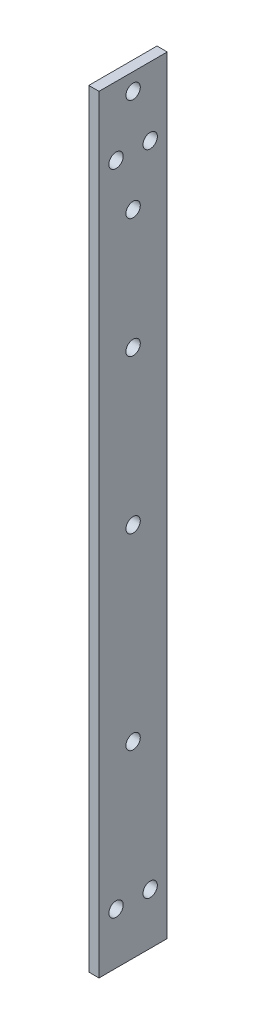
ISO-10303-21;
HEADER;
FILE_DESCRIPTION(('STEP AP214'),'2;1');
FILE_NAME('part.step','',(''),(''),'','','');
FILE_SCHEMA(('AUTOMOTIVE_DESIGN { 1 0 10303 214 1 1 1 1 }'));
ENDSEC;
DATA;
#1=APPLICATION_CONTEXT('core data for automotive mechanical design processes');
#2=APPLICATION_PROTOCOL_DEFINITION('international standard','automotive_design',2000,#1);
#3=PRODUCT_CONTEXT('',#1,'mechanical');
#4=PRODUCT('Part','Part','',(#3));
#5=PRODUCT_RELATED_PRODUCT_CATEGORY('part','',(#4));
#6=PRODUCT_DEFINITION_FORMATION('','',#4);
#7=PRODUCT_DEFINITION_CONTEXT('part definition',#1,'design');
#8=PRODUCT_DEFINITION('design','',#6,#7);
#9=PRODUCT_DEFINITION_SHAPE('','',#8);
#10=(LENGTH_UNIT() NAMED_UNIT(*) SI_UNIT(.MILLI.,.METRE.));
#11=(NAMED_UNIT(*) PLANE_ANGLE_UNIT() SI_UNIT($,.RADIAN.));
#12=(NAMED_UNIT(*) SI_UNIT($,.STERADIAN.) SOLID_ANGLE_UNIT());
#13=UNCERTAINTY_MEASURE_WITH_UNIT(LENGTH_MEASURE(1.E-05),#10,'distance_accuracy_value','');
#14=(GEOMETRIC_REPRESENTATION_CONTEXT(3) GLOBAL_UNCERTAINTY_ASSIGNED_CONTEXT((#13)) GLOBAL_UNIT_ASSIGNED_CONTEXT((#10,
#11,#12)) REPRESENTATION_CONTEXT('',''));
#15=CARTESIAN_POINT('',(0.,0.,0.));
#16=DIRECTION('',(0.,0.,1.));
#17=DIRECTION('',(1.,0.,0.));
#18=AXIS2_PLACEMENT_3D('',#15,#16,#17);
#19=CARTESIAN_POINT('',(-36.,220.,20.));
#20=DIRECTION('',(0.,1.,0.));
#21=DIRECTION('',(0.,0.,1.));
#22=AXIS2_PLACEMENT_3D('',#19,#20,#21);
#23=PLANE('',#22);
#24=DIRECTION('',(0.,0.,-1.));
#25=VECTOR('',#24,1.);
#26=CARTESIAN_POINT('',(-39.,220.,20.));
#27=LINE('',#26,#25);
#28=CARTESIAN_POINT('',(-39.,220.,20.));
#29=VERTEX_POINT('',#28);
#30=CARTESIAN_POINT('',(-39.,220.,0.));
#31=VERTEX_POINT('',#30);
#32=EDGE_CURVE('E97',#29,#31,#27,.T.);
#33=ORIENTED_EDGE('',*,*,#32,.F.);
#34=DIRECTION('',(-1.,0.,0.));
#35=VECTOR('',#34,1.);
#36=CARTESIAN_POINT('',(-36.,220.,20.));
#37=LINE('',#36,#35);
#38=CARTESIAN_POINT('',(-36.,220.,20.));
#39=VERTEX_POINT('',#38);
#40=EDGE_CURVE('E11',#39,#29,#37,.T.);
#41=ORIENTED_EDGE('',*,*,#40,.F.);
#42=DIRECTION('',(0.,0.,-1.));
#43=VECTOR('',#42,1.);
#44=CARTESIAN_POINT('',(-36.,220.,20.));
#45=LINE('',#44,#43);
#46=CARTESIAN_POINT('',(-36.,220.,0.));
#47=VERTEX_POINT('',#46);
#48=EDGE_CURVE('E90',#39,#47,#45,.T.);
#49=ORIENTED_EDGE('',*,*,#48,.T.);
#50=DIRECTION('',(-1.,0.,0.));
#51=VECTOR('',#50,1.);
#52=CARTESIAN_POINT('',(-36.,220.,0.));
#53=LINE('',#52,#51);
#54=EDGE_CURVE('E35',#47,#31,#53,.T.);
#55=ORIENTED_EDGE('',*,*,#54,.T.);
#56=EDGE_LOOP('',(#33,#41,#49,#55));
#57=FACE_BOUND('',#56,.T.);
#58=ADVANCED_FACE('F32',(#57),#23,.T.);
#59=CARTESIAN_POINT('',(-36.,-5.,20.));
#60=DIRECTION('',(0.,0.,1.));
#61=DIRECTION('',(1.,0.,0.));
#62=AXIS2_PLACEMENT_3D('',#59,#60,#61);
#63=PLANE('',#62);
#64=DIRECTION('',(0.,1.,0.));
#65=VECTOR('',#64,1.);
#66=CARTESIAN_POINT('',(-39.,-5.,20.));
#67=LINE('',#66,#65);
#68=CARTESIAN_POINT('',(-39.,-5.,20.));
#69=VERTEX_POINT('',#68);
#70=EDGE_CURVE('E92',#69,#29,#67,.T.);
#71=ORIENTED_EDGE('',*,*,#70,.F.);
#72=DIRECTION('',(-1.,0.,0.));
#73=VECTOR('',#72,1.);
#74=CARTESIAN_POINT('',(-36.,-5.,20.));
#75=LINE('',#74,#73);
#76=CARTESIAN_POINT('',(-36.,-5.,20.));
#77=VERTEX_POINT('',#76);
#78=EDGE_CURVE('E41',#77,#69,#75,.T.);
#79=ORIENTED_EDGE('',*,*,#78,.F.);
#80=DIRECTION('',(0.,1.,0.));
#81=VECTOR('',#80,1.);
#82=CARTESIAN_POINT('',(-36.,-5.,20.));
#83=LINE('',#82,#81);
#84=EDGE_CURVE('E87',#77,#39,#83,.T.);
#85=ORIENTED_EDGE('',*,*,#84,.T.);
#86=ORIENTED_EDGE('',*,*,#40,.T.);
#87=EDGE_LOOP('',(#71,#79,#85,#86));
#88=FACE_BOUND('',#87,.T.);
#89=ADVANCED_FACE('F108',(#88),#63,.T.);
#90=CARTESIAN_POINT('',(-36.,-5.,0.));
#91=DIRECTION('',(0.,-1.,0.));
#92=DIRECTION('',(0.,0.,-1.));
#93=AXIS2_PLACEMENT_3D('',#90,#91,#92);
#94=PLANE('',#93);
#95=DIRECTION('',(0.,0.,1.));
#96=VECTOR('',#95,1.);
#97=CARTESIAN_POINT('',(-39.,-5.,0.));
#98=LINE('',#97,#96);
#99=CARTESIAN_POINT('',(-39.,-5.,0.));
#100=VERTEX_POINT('',#99);
#101=EDGE_CURVE('E82',#100,#69,#98,.T.);
#102=ORIENTED_EDGE('',*,*,#101,.F.);
#103=DIRECTION('',(-1.,0.,0.));
#104=VECTOR('',#103,1.);
#105=CARTESIAN_POINT('',(-36.,-5.,0.));
#106=LINE('',#105,#104);
#107=CARTESIAN_POINT('',(-36.,-5.,0.));
#108=VERTEX_POINT('',#107);
#109=EDGE_CURVE('E77',#108,#100,#106,.T.);
#110=ORIENTED_EDGE('',*,*,#109,.F.);
#111=DIRECTION('',(0.,0.,1.));
#112=VECTOR('',#111,1.);
#113=CARTESIAN_POINT('',(-36.,-5.,0.));
#114=LINE('',#113,#112);
#115=EDGE_CURVE('E80',#108,#77,#114,.T.);
#116=ORIENTED_EDGE('',*,*,#115,.T.);
#117=ORIENTED_EDGE('',*,*,#78,.T.);
#118=EDGE_LOOP('',(#102,#110,#116,#117));
#119=FACE_BOUND('',#118,.T.);
#120=ADVANCED_FACE('F79',(#119),#94,.T.);
#121=CARTESIAN_POINT('',(-36.,220.,0.));
#122=DIRECTION('',(0.,0.,-1.));
#123=DIRECTION('',(-1.,0.,0.));
#124=AXIS2_PLACEMENT_3D('',#121,#122,#123);
#125=PLANE('',#124);
#126=DIRECTION('',(0.,-1.,0.));
#127=VECTOR('',#126,1.);
#128=CARTESIAN_POINT('',(-39.,220.,0.));
#129=LINE('',#128,#127);
#130=EDGE_CURVE('E100',#31,#100,#129,.T.);
#131=ORIENTED_EDGE('',*,*,#130,.F.);
#132=ORIENTED_EDGE('',*,*,#54,.F.);
#133=DIRECTION('',(0.,-1.,0.));
#134=VECTOR('',#133,1.);
#135=CARTESIAN_POINT('',(-36.,220.,0.));
#136=LINE('',#135,#134);
#137=EDGE_CURVE('E86',#47,#108,#136,.T.);
#138=ORIENTED_EDGE('',*,*,#137,.T.);
#139=ORIENTED_EDGE('',*,*,#109,.T.);
#140=EDGE_LOOP('',(#131,#132,#138,#139));
#141=FACE_BOUND('',#140,.T.);
#142=ADVANCED_FACE('F89',(#141),#125,.T.);
#143=CARTESIAN_POINT('',(-36.,0.,0.));
#144=DIRECTION('',(-1.,0.,0.));
#145=DIRECTION('',(0.,0.,1.));
#146=AXIS2_PLACEMENT_3D('',#143,#144,#145);
#147=PLANE('',#146);
#148=CARTESIAN_POINT('',(-36.,50.,9.99999999999999));
#149=DIRECTION('',(-1.,0.,0.));
#150=DIRECTION('',(0.,0.,-1.));
#151=AXIS2_PLACEMENT_3D('',#148,#149,#150);
#152=CIRCLE('',#151,2.09999999999999);
#153=CARTESIAN_POINT('',(-36.,50.,7.9));
#154=VERTEX_POINT('',#153);
#155=EDGE_CURVE('E169',#154,#154,#152,.T.);
#156=ORIENTED_EDGE('',*,*,#155,.T.);
#157=EDGE_LOOP('',(#156));
#158=FACE_BOUND('',#157,.T.);
#159=CARTESIAN_POINT('',(-36.,105.,10.));
#160=DIRECTION('',(-1.,0.,0.));
#161=DIRECTION('',(0.,0.,-1.));
#162=AXIS2_PLACEMENT_3D('',#159,#160,#161);
#163=CIRCLE('',#162,2.09999999999999);
#164=CARTESIAN_POINT('',(-36.,105.,7.90000000000001));
#165=VERTEX_POINT('',#164);
#166=EDGE_CURVE('E177',#165,#165,#163,.T.);
#167=ORIENTED_EDGE('',*,*,#166,.T.);
#168=EDGE_LOOP('',(#167));
#169=FACE_BOUND('',#168,.T.);
#170=CARTESIAN_POINT('',(-36.,150.,10.));
#171=DIRECTION('',(-1.,0.,0.));
#172=DIRECTION('',(0.,0.,-1.));
#173=AXIS2_PLACEMENT_3D('',#170,#171,#172);
#174=CIRCLE('',#173,2.09999999999999);
#175=CARTESIAN_POINT('',(-36.,150.,7.90000000000001));
#176=VERTEX_POINT('',#175);
#177=EDGE_CURVE('E183',#176,#176,#174,.T.);
#178=ORIENTED_EDGE('',*,*,#177,.T.);
#179=EDGE_LOOP('',(#178));
#180=FACE_BOUND('',#179,.T.);
#181=CARTESIAN_POINT('',(-36.,200.,5.));
#182=DIRECTION('',(-1.,0.,0.));
#183=DIRECTION('',(0.,0.,-1.));
#184=AXIS2_PLACEMENT_3D('',#181,#182,#183);
#185=CIRCLE('',#184,2.09999999999999);
#186=CARTESIAN_POINT('',(-36.,200.,2.90000000000001));
#187=VERTEX_POINT('',#186);
#188=EDGE_CURVE('E189',#187,#187,#185,.T.);
#189=ORIENTED_EDGE('',*,*,#188,.T.);
#190=EDGE_LOOP('',(#189));
#191=FACE_BOUND('',#190,.T.);
#192=CARTESIAN_POINT('',(-36.,10.,15.));
#193=DIRECTION('',(-1.,0.,0.));
#194=DIRECTION('',(0.,0.,-1.));
#195=AXIS2_PLACEMENT_3D('',#192,#193,#194);
#196=CIRCLE('',#195,2.1);
#197=CARTESIAN_POINT('',(-36.,10.,12.9));
#198=VERTEX_POINT('',#197);
#199=EDGE_CURVE('E195',#198,#198,#196,.T.);
#200=ORIENTED_EDGE('',*,*,#199,.T.);
#201=EDGE_LOOP('',(#200));
#202=FACE_BOUND('',#201,.T.);
#203=CARTESIAN_POINT('',(-36.,10.,5.));
#204=DIRECTION('',(-1.,0.,0.));
#205=DIRECTION('',(0.,0.,-1.));
#206=AXIS2_PLACEMENT_3D('',#203,#204,#205);
#207=CIRCLE('',#206,2.1);
#208=CARTESIAN_POINT('',(-36.,10.,2.9));
#209=VERTEX_POINT('',#208);
#210=EDGE_CURVE('E201',#209,#209,#207,.T.);
#211=ORIENTED_EDGE('',*,*,#210,.T.);
#212=EDGE_LOOP('',(#211));
#213=FACE_BOUND('',#212,.T.);
#214=CARTESIAN_POINT('',(-36.,185.,10.));
#215=DIRECTION('',(-1.,0.,0.));
#216=DIRECTION('',(0.,0.,-1.));
#217=AXIS2_PLACEMENT_3D('',#214,#215,#216);
#218=CIRCLE('',#217,2.09999999999999);
#219=CARTESIAN_POINT('',(-36.,185.,7.90000000000001));
#220=VERTEX_POINT('',#219);
#221=EDGE_CURVE('E207',#220,#220,#218,.T.);
#222=ORIENTED_EDGE('',*,*,#221,.T.);
#223=EDGE_LOOP('',(#222));
#224=FACE_BOUND('',#223,.T.);
#225=CARTESIAN_POINT('',(-36.,200.,15.));
#226=DIRECTION('',(-1.,0.,0.));
#227=DIRECTION('',(0.,0.,-1.));
#228=AXIS2_PLACEMENT_3D('',#225,#226,#227);
#229=CIRCLE('',#228,2.09999999999999);
#230=CARTESIAN_POINT('',(-36.,200.,12.9));
#231=VERTEX_POINT('',#230);
#232=EDGE_CURVE('E213',#231,#231,#229,.T.);
#233=ORIENTED_EDGE('',*,*,#232,.T.);
#234=EDGE_LOOP('',(#233));
#235=FACE_BOUND('',#234,.T.);
#236=CARTESIAN_POINT('',(-36.,215.,10.));
#237=DIRECTION('',(-1.,0.,0.));
#238=DIRECTION('',(0.,0.,-1.));
#239=AXIS2_PLACEMENT_3D('',#236,#237,#238);
#240=CIRCLE('',#239,2.09999999999999);
#241=CARTESIAN_POINT('',(-36.,215.,7.90000000000001));
#242=VERTEX_POINT('',#241);
#243=EDGE_CURVE('E101',#242,#242,#240,.T.);
#244=ORIENTED_EDGE('',*,*,#243,.T.);
#245=EDGE_LOOP('',(#244));
#246=FACE_BOUND('',#245,.T.);
#247=ORIENTED_EDGE('',*,*,#48,.F.);
#248=ORIENTED_EDGE('',*,*,#84,.F.);
#249=ORIENTED_EDGE('',*,*,#115,.F.);
#250=ORIENTED_EDGE('',*,*,#137,.F.);
#251=EDGE_LOOP('',(#247,#248,#249,#250));
#252=FACE_BOUND('',#251,.T.);
#253=ADVANCED_FACE('F85',(#158,#169,#180,#191,#202,#213,#224,#235,#246,#252),#147,.F.);
#254=CARTESIAN_POINT('',(-39.,0.,0.));
#255=DIRECTION('',(-1.,0.,0.));
#256=DIRECTION('',(0.,0.,1.));
#257=AXIS2_PLACEMENT_3D('',#254,#255,#256);
#258=PLANE('',#257);
#259=CARTESIAN_POINT('',(-39.,50.,9.99999999999999));
#260=DIRECTION('',(-1.,0.,0.));
#261=DIRECTION('',(0.,0.,-1.));
#262=AXIS2_PLACEMENT_3D('',#259,#260,#261);
#263=CIRCLE('',#262,2.09999999999999);
#264=CARTESIAN_POINT('',(-39.,50.,7.9));
#265=VERTEX_POINT('',#264);
#266=EDGE_CURVE('E172',#265,#265,#263,.T.);
#267=ORIENTED_EDGE('',*,*,#266,.F.);
#268=EDGE_LOOP('',(#267));
#269=FACE_BOUND('',#268,.T.);
#270=CARTESIAN_POINT('',(-39.,105.,10.));
#271=DIRECTION('',(-1.,0.,0.));
#272=DIRECTION('',(0.,0.,-1.));
#273=AXIS2_PLACEMENT_3D('',#270,#271,#272);
#274=CIRCLE('',#273,2.09999999999999);
#275=CARTESIAN_POINT('',(-39.,105.,7.90000000000001));
#276=VERTEX_POINT('',#275);
#277=EDGE_CURVE('E174',#276,#276,#274,.T.);
#278=ORIENTED_EDGE('',*,*,#277,.F.);
#279=EDGE_LOOP('',(#278));
#280=FACE_BOUND('',#279,.T.);
#281=CARTESIAN_POINT('',(-39.,150.,10.));
#282=DIRECTION('',(-1.,0.,0.));
#283=DIRECTION('',(0.,0.,-1.));
#284=AXIS2_PLACEMENT_3D('',#281,#282,#283);
#285=CIRCLE('',#284,2.09999999999999);
#286=CARTESIAN_POINT('',(-39.,150.,7.90000000000001));
#287=VERTEX_POINT('',#286);
#288=EDGE_CURVE('E180',#287,#287,#285,.T.);
#289=ORIENTED_EDGE('',*,*,#288,.F.);
#290=EDGE_LOOP('',(#289));
#291=FACE_BOUND('',#290,.T.);
#292=CARTESIAN_POINT('',(-39.,200.,5.));
#293=DIRECTION('',(-1.,0.,0.));
#294=DIRECTION('',(0.,0.,-1.));
#295=AXIS2_PLACEMENT_3D('',#292,#293,#294);
#296=CIRCLE('',#295,2.09999999999999);
#297=CARTESIAN_POINT('',(-39.,200.,2.90000000000001));
#298=VERTEX_POINT('',#297);
#299=EDGE_CURVE('E186',#298,#298,#296,.T.);
#300=ORIENTED_EDGE('',*,*,#299,.F.);
#301=EDGE_LOOP('',(#300));
#302=FACE_BOUND('',#301,.T.);
#303=CARTESIAN_POINT('',(-39.,10.,15.));
#304=DIRECTION('',(-1.,0.,0.));
#305=DIRECTION('',(0.,0.,-1.));
#306=AXIS2_PLACEMENT_3D('',#303,#304,#305);
#307=CIRCLE('',#306,2.1);
#308=CARTESIAN_POINT('',(-39.,10.,12.9));
#309=VERTEX_POINT('',#308);
#310=EDGE_CURVE('E192',#309,#309,#307,.T.);
#311=ORIENTED_EDGE('',*,*,#310,.F.);
#312=EDGE_LOOP('',(#311));
#313=FACE_BOUND('',#312,.T.);
#314=CARTESIAN_POINT('',(-39.,10.,5.));
#315=DIRECTION('',(-1.,0.,0.));
#316=DIRECTION('',(0.,0.,-1.));
#317=AXIS2_PLACEMENT_3D('',#314,#315,#316);
#318=CIRCLE('',#317,2.1);
#319=CARTESIAN_POINT('',(-39.,10.,2.9));
#320=VERTEX_POINT('',#319);
#321=EDGE_CURVE('E198',#320,#320,#318,.T.);
#322=ORIENTED_EDGE('',*,*,#321,.F.);
#323=EDGE_LOOP('',(#322));
#324=FACE_BOUND('',#323,.T.);
#325=CARTESIAN_POINT('',(-39.,185.,10.));
#326=DIRECTION('',(-1.,0.,0.));
#327=DIRECTION('',(0.,0.,-1.));
#328=AXIS2_PLACEMENT_3D('',#325,#326,#327);
#329=CIRCLE('',#328,2.09999999999999);
#330=CARTESIAN_POINT('',(-39.,185.,7.90000000000001));
#331=VERTEX_POINT('',#330);
#332=EDGE_CURVE('E204',#331,#331,#329,.T.);
#333=ORIENTED_EDGE('',*,*,#332,.F.);
#334=EDGE_LOOP('',(#333));
#335=FACE_BOUND('',#334,.T.);
#336=CARTESIAN_POINT('',(-39.,200.,15.));
#337=DIRECTION('',(-1.,0.,0.));
#338=DIRECTION('',(0.,0.,-1.));
#339=AXIS2_PLACEMENT_3D('',#336,#337,#338);
#340=CIRCLE('',#339,2.09999999999999);
#341=CARTESIAN_POINT('',(-39.,200.,12.9));
#342=VERTEX_POINT('',#341);
#343=EDGE_CURVE('E210',#342,#342,#340,.T.);
#344=ORIENTED_EDGE('',*,*,#343,.F.);
#345=EDGE_LOOP('',(#344));
#346=FACE_BOUND('',#345,.T.);
#347=CARTESIAN_POINT('',(-39.,215.,10.));
#348=DIRECTION('',(-1.,0.,0.));
#349=DIRECTION('',(0.,0.,-1.));
#350=AXIS2_PLACEMENT_3D('',#347,#348,#349);
#351=CIRCLE('',#350,2.09999999999999);
#352=CARTESIAN_POINT('',(-39.,215.,7.90000000000001));
#353=VERTEX_POINT('',#352);
#354=EDGE_CURVE('E216',#353,#353,#351,.T.);
#355=ORIENTED_EDGE('',*,*,#354,.F.);
#356=EDGE_LOOP('',(#355));
#357=FACE_BOUND('',#356,.T.);
#358=ORIENTED_EDGE('',*,*,#32,.T.);
#359=ORIENTED_EDGE('',*,*,#130,.T.);
#360=ORIENTED_EDGE('',*,*,#101,.T.);
#361=ORIENTED_EDGE('',*,*,#70,.T.);
#362=EDGE_LOOP('',(#358,#359,#360,#361));
#363=FACE_BOUND('',#362,.T.);
#364=ADVANCED_FACE('F107',(#269,#280,#291,#302,#313,#324,#335,#346,#357,#363),#258,.T.);
#365=CARTESIAN_POINT('',(-36.,215.,10.));
#366=DIRECTION('',(-1.,0.,0.));
#367=DIRECTION('',(0.,0.,1.));
#368=AXIS2_PLACEMENT_3D('',#365,#366,#367);
#369=CYLINDRICAL_SURFACE('',#368,2.09999999999999);
#370=ORIENTED_EDGE('',*,*,#243,.F.);
#371=EDGE_LOOP('',(#370));
#372=FACE_BOUND('',#371,.T.);
#373=ORIENTED_EDGE('',*,*,#354,.T.);
#374=EDGE_LOOP('',(#373));
#375=FACE_BOUND('',#374,.T.);
#376=ADVANCED_FACE('F126',(#372,#375),#369,.F.);
#377=CARTESIAN_POINT('',(-36.,200.,15.));
#378=DIRECTION('',(-1.,0.,0.));
#379=DIRECTION('',(0.,0.,1.));
#380=AXIS2_PLACEMENT_3D('',#377,#378,#379);
#381=CYLINDRICAL_SURFACE('',#380,2.09999999999999);
#382=ORIENTED_EDGE('',*,*,#232,.F.);
#383=EDGE_LOOP('',(#382));
#384=FACE_BOUND('',#383,.T.);
#385=ORIENTED_EDGE('',*,*,#343,.T.);
#386=EDGE_LOOP('',(#385));
#387=FACE_BOUND('',#386,.T.);
#388=ADVANCED_FACE('F133',(#384,#387),#381,.F.);
#389=CARTESIAN_POINT('',(-36.,185.,10.));
#390=DIRECTION('',(-1.,0.,0.));
#391=DIRECTION('',(0.,0.,1.));
#392=AXIS2_PLACEMENT_3D('',#389,#390,#391);
#393=CYLINDRICAL_SURFACE('',#392,2.09999999999999);
#394=ORIENTED_EDGE('',*,*,#221,.F.);
#395=EDGE_LOOP('',(#394));
#396=FACE_BOUND('',#395,.T.);
#397=ORIENTED_EDGE('',*,*,#332,.T.);
#398=EDGE_LOOP('',(#397));
#399=FACE_BOUND('',#398,.T.);
#400=ADVANCED_FACE('F137',(#396,#399),#393,.F.);
#401=CARTESIAN_POINT('',(-36.,10.,5.));
#402=DIRECTION('',(-1.,0.,0.));
#403=DIRECTION('',(0.,0.,1.));
#404=AXIS2_PLACEMENT_3D('',#401,#402,#403);
#405=CYLINDRICAL_SURFACE('',#404,2.1);
#406=ORIENTED_EDGE('',*,*,#210,.F.);
#407=EDGE_LOOP('',(#406));
#408=FACE_BOUND('',#407,.T.);
#409=ORIENTED_EDGE('',*,*,#321,.T.);
#410=EDGE_LOOP('',(#409));
#411=FACE_BOUND('',#410,.T.);
#412=ADVANCED_FACE('F141',(#408,#411),#405,.F.);
#413=CARTESIAN_POINT('',(-36.,10.,15.));
#414=DIRECTION('',(-1.,0.,0.));
#415=DIRECTION('',(0.,0.,1.));
#416=AXIS2_PLACEMENT_3D('',#413,#414,#415);
#417=CYLINDRICAL_SURFACE('',#416,2.1);
#418=ORIENTED_EDGE('',*,*,#199,.F.);
#419=EDGE_LOOP('',(#418));
#420=FACE_BOUND('',#419,.T.);
#421=ORIENTED_EDGE('',*,*,#310,.T.);
#422=EDGE_LOOP('',(#421));
#423=FACE_BOUND('',#422,.T.);
#424=ADVANCED_FACE('F145',(#420,#423),#417,.F.);
#425=CARTESIAN_POINT('',(-36.,200.,5.));
#426=DIRECTION('',(-1.,0.,0.));
#427=DIRECTION('',(0.,0.,1.));
#428=AXIS2_PLACEMENT_3D('',#425,#426,#427);
#429=CYLINDRICAL_SURFACE('',#428,2.09999999999999);
#430=ORIENTED_EDGE('',*,*,#188,.F.);
#431=EDGE_LOOP('',(#430));
#432=FACE_BOUND('',#431,.T.);
#433=ORIENTED_EDGE('',*,*,#299,.T.);
#434=EDGE_LOOP('',(#433));
#435=FACE_BOUND('',#434,.T.);
#436=ADVANCED_FACE('F149',(#432,#435),#429,.F.);
#437=CARTESIAN_POINT('',(-36.,150.,10.));
#438=DIRECTION('',(-1.,0.,0.));
#439=DIRECTION('',(0.,0.,1.));
#440=AXIS2_PLACEMENT_3D('',#437,#438,#439);
#441=CYLINDRICAL_SURFACE('',#440,2.09999999999999);
#442=ORIENTED_EDGE('',*,*,#177,.F.);
#443=EDGE_LOOP('',(#442));
#444=FACE_BOUND('',#443,.T.);
#445=ORIENTED_EDGE('',*,*,#288,.T.);
#446=EDGE_LOOP('',(#445));
#447=FACE_BOUND('',#446,.T.);
#448=ADVANCED_FACE('F153',(#444,#447),#441,.F.);
#449=CARTESIAN_POINT('',(-36.,105.,10.));
#450=DIRECTION('',(-1.,0.,0.));
#451=DIRECTION('',(0.,0.,1.));
#452=AXIS2_PLACEMENT_3D('',#449,#450,#451);
#453=CYLINDRICAL_SURFACE('',#452,2.09999999999999);
#454=ORIENTED_EDGE('',*,*,#166,.F.);
#455=EDGE_LOOP('',(#454));
#456=FACE_BOUND('',#455,.T.);
#457=ORIENTED_EDGE('',*,*,#277,.T.);
#458=EDGE_LOOP('',(#457));
#459=FACE_BOUND('',#458,.T.);
#460=ADVANCED_FACE('F157',(#456,#459),#453,.F.);
#461=CARTESIAN_POINT('',(-36.,50.,9.99999999999999));
#462=DIRECTION('',(-1.,0.,0.));
#463=DIRECTION('',(0.,0.,1.));
#464=AXIS2_PLACEMENT_3D('',#461,#462,#463);
#465=CYLINDRICAL_SURFACE('',#464,2.09999999999999);
#466=ORIENTED_EDGE('',*,*,#155,.F.);
#467=EDGE_LOOP('',(#466));
#468=FACE_BOUND('',#467,.T.);
#469=ORIENTED_EDGE('',*,*,#266,.T.);
#470=EDGE_LOOP('',(#469));
#471=FACE_BOUND('',#470,.T.);
#472=ADVANCED_FACE('F161',(#468,#471),#465,.F.);
#473=CLOSED_SHELL('',(#58,#89,#120,#142,#253,#364,#376,#388,#400,#412,#424,#436,#448,#460,#472));
#474=MANIFOLD_SOLID_BREP('B2',#473);
#475=ADVANCED_BREP_SHAPE_REPRESENTATION('',(#18,#474),#14);
#476=SHAPE_DEFINITION_REPRESENTATION(#9,#475);
ENDSEC;
END-ISO-10303-21;
